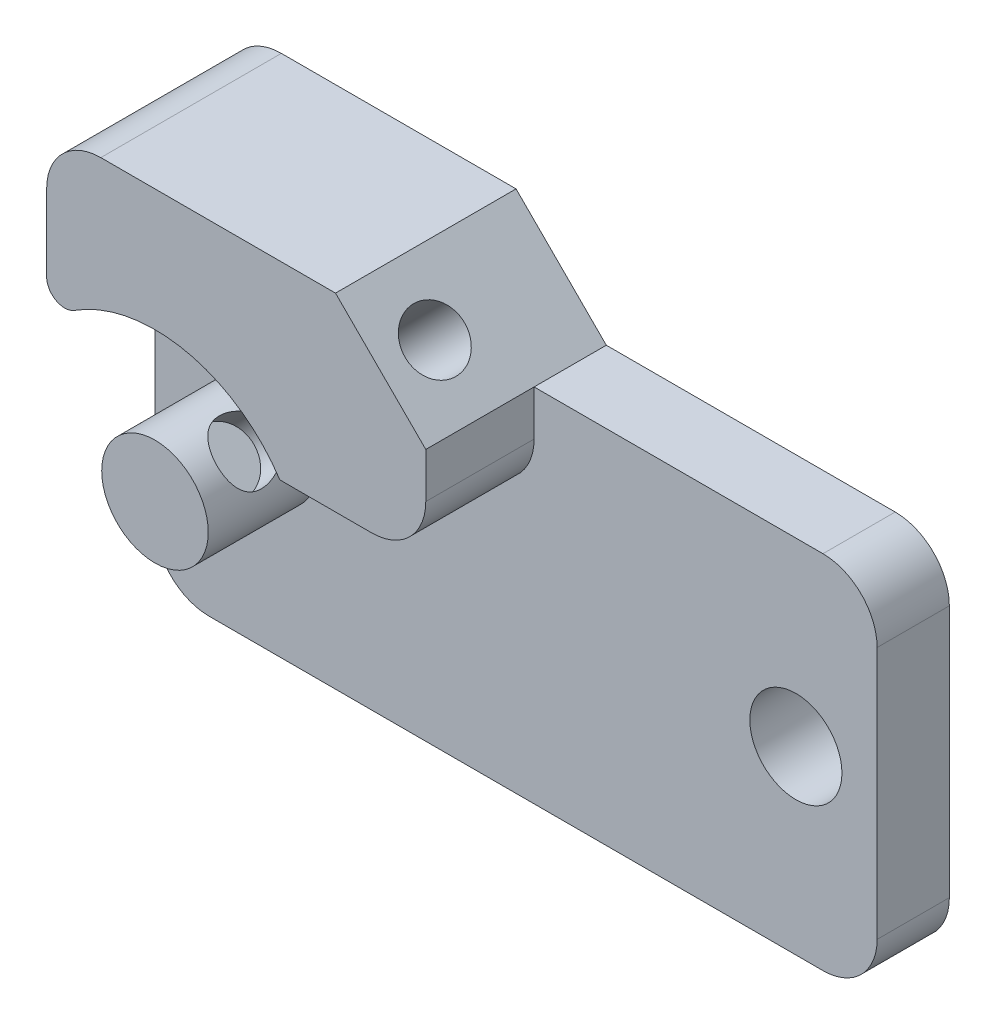
ISO-10303-21;
HEADER;
FILE_DESCRIPTION(('STEP AP214'),'2;1');
FILE_NAME('part.step','',(''),(''),'','','');
FILE_SCHEMA(('AUTOMOTIVE_DESIGN { 1 0 10303 214 1 1 1 1 }'));
ENDSEC;
DATA;
#1=APPLICATION_CONTEXT('core data for automotive mechanical design processes');
#2=APPLICATION_PROTOCOL_DEFINITION('international standard','automotive_design',2000,#1);
#3=PRODUCT_CONTEXT('',#1,'mechanical');
#4=PRODUCT('Part','Part','',(#3));
#5=PRODUCT_RELATED_PRODUCT_CATEGORY('part','',(#4));
#6=PRODUCT_DEFINITION_FORMATION('','',#4);
#7=PRODUCT_DEFINITION_CONTEXT('part definition',#1,'design');
#8=PRODUCT_DEFINITION('design','',#6,#7);
#9=PRODUCT_DEFINITION_SHAPE('','',#8);
#10=(LENGTH_UNIT() NAMED_UNIT(*) SI_UNIT(.MILLI.,.METRE.));
#11=(NAMED_UNIT(*) PLANE_ANGLE_UNIT() SI_UNIT($,.RADIAN.));
#12=(NAMED_UNIT(*) SI_UNIT($,.STERADIAN.) SOLID_ANGLE_UNIT());
#13=UNCERTAINTY_MEASURE_WITH_UNIT(LENGTH_MEASURE(1.E-05),#10,'distance_accuracy_value','');
#14=(GEOMETRIC_REPRESENTATION_CONTEXT(3) GLOBAL_UNCERTAINTY_ASSIGNED_CONTEXT((#13)) GLOBAL_UNIT_ASSIGNED_CONTEXT((#10,
#11,#12)) REPRESENTATION_CONTEXT('',''));
#15=CARTESIAN_POINT('',(0.,0.,0.));
#16=DIRECTION('',(0.,0.,1.));
#17=DIRECTION('',(1.,0.,0.));
#18=AXIS2_PLACEMENT_3D('',#15,#16,#17);
#19=CARTESIAN_POINT('',(0.,0.,4.));
#20=DIRECTION('',(0.,0.,-1.));
#21=DIRECTION('',(-1.,0.,0.));
#22=AXIS2_PLACEMENT_3D('',#19,#20,#21);
#23=PLANE('',#22);
#24=CARTESIAN_POINT('',(35.5,10.,4.));
#25=DIRECTION('',(0.,0.,-1.));
#26=DIRECTION('',(-1.,0.,0.));
#27=AXIS2_PLACEMENT_3D('',#24,#25,#26);
#28=CIRCLE('',#27,2.55);
#29=CARTESIAN_POINT('',(32.95,10.,4.));
#30=VERTEX_POINT('',#29);
#31=EDGE_CURVE('E186',#30,#30,#28,.T.);
#32=ORIENTED_EDGE('',*,*,#31,.T.);
#33=EDGE_LOOP('',(#32));
#34=FACE_BOUND('',#33,.T.);
#35=DIRECTION('',(0.,1.,0.));
#36=VECTOR('',#35,1.);
#37=CARTESIAN_POINT('',(40.,0.,4.));
#38=LINE('',#37,#36);
#39=CARTESIAN_POINT('',(40.,3.,4.));
#40=VERTEX_POINT('',#39);
#41=CARTESIAN_POINT('',(40.,17.,4.));
#42=VERTEX_POINT('',#41);
#43=EDGE_CURVE('E200',#40,#42,#38,.T.);
#44=ORIENTED_EDGE('',*,*,#43,.T.);
#45=CARTESIAN_POINT('',(37.,17.,4.));
#46=DIRECTION('',(0.,0.,-1.));
#47=DIRECTION('',(-1.,0.,0.));
#48=AXIS2_PLACEMENT_3D('',#45,#46,#47);
#49=CIRCLE('',#48,3.);
#50=CARTESIAN_POINT('',(37.,20.,4.));
#51=VERTEX_POINT('',#50);
#52=EDGE_CURVE('E262',#42,#51,#49,.F.);
#53=ORIENTED_EDGE('',*,*,#52,.T.);
#54=DIRECTION('',(-1.,0.,0.));
#55=VECTOR('',#54,1.);
#56=CARTESIAN_POINT('',(0.,20.,4.));
#57=LINE('',#56,#55);
#58=CARTESIAN_POINT('',(21.,20.,4.));
#59=VERTEX_POINT('',#58);
#60=EDGE_CURVE('E202',#51,#59,#57,.T.);
#61=ORIENTED_EDGE('',*,*,#60,.T.);
#62=DIRECTION('',(0.,1.,0.));
#63=VECTOR('',#62,1.);
#64=CARTESIAN_POINT('',(21.,25.,4.));
#65=LINE('',#64,#63);
#66=CARTESIAN_POINT('',(21.,17.5,4.));
#67=VERTEX_POINT('',#66);
#68=EDGE_CURVE('E168',#67,#59,#65,.T.);
#69=ORIENTED_EDGE('',*,*,#68,.F.);
#70=CARTESIAN_POINT('',(18.,17.5,4.));
#71=DIRECTION('',(0.,0.,-1.));
#72=DIRECTION('',(-1.,0.,0.));
#73=AXIS2_PLACEMENT_3D('',#70,#71,#72);
#74=CIRCLE('',#73,3.);
#75=CARTESIAN_POINT('',(18.,14.5,4.));
#76=VERTEX_POINT('',#75);
#77=EDGE_CURVE('E167',#67,#76,#74,.T.);
#78=ORIENTED_EDGE('',*,*,#77,.T.);
#79=DIRECTION('',(1.,0.,0.));
#80=VECTOR('',#79,1.);
#81=CARTESIAN_POINT('',(21.,14.5,4.));
#82=LINE('',#81,#80);
#83=CARTESIAN_POINT('',(12.9146583429697,14.5,4.));
#84=VERTEX_POINT('',#83);
#85=EDGE_CURVE('E159',#84,#76,#82,.T.);
#86=ORIENTED_EDGE('',*,*,#85,.F.);
#87=CARTESIAN_POINT('',(6.,10.,4.));
#88=DIRECTION('',(0.,0.,1.));
#89=DIRECTION('',(1.,0.,0.));
#90=AXIS2_PLACEMENT_3D('',#87,#88,#89);
#91=CIRCLE('',#90,8.25);
#92=CARTESIAN_POINT('',(1.54054054054054,16.9408732396895,4.));
#93=VERTEX_POINT('',#92);
#94=EDGE_CURVE('E146',#84,#93,#91,.T.);
#95=ORIENTED_EDGE('',*,*,#94,.T.);
#96=CARTESIAN_POINT('',(1.,17.7821912081367,4.));
#97=DIRECTION('',(0.,0.,-1.));
#98=DIRECTION('',(-1.,0.,0.));
#99=AXIS2_PLACEMENT_3D('',#96,#97,#98);
#100=CIRCLE('',#99,1.);
#101=CARTESIAN_POINT('',(0.,17.7821912081367,4.));
#102=VERTEX_POINT('',#101);
#103=EDGE_CURVE('E11',#93,#102,#100,.T.);
#104=ORIENTED_EDGE('',*,*,#103,.T.);
#105=DIRECTION('',(0.,-1.,0.));
#106=VECTOR('',#105,1.);
#107=CARTESIAN_POINT('',(0.,0.,4.));
#108=LINE('',#107,#106);
#109=CARTESIAN_POINT('',(0.,3.,4.));
#110=VERTEX_POINT('',#109);
#111=EDGE_CURVE('E193',#102,#110,#108,.T.);
#112=ORIENTED_EDGE('',*,*,#111,.T.);
#113=CARTESIAN_POINT('',(3.,3.,4.));
#114=DIRECTION('',(0.,0.,-1.));
#115=DIRECTION('',(-1.,0.,0.));
#116=AXIS2_PLACEMENT_3D('',#113,#114,#115);
#117=CIRCLE('',#116,3.);
#118=CARTESIAN_POINT('',(3.,0.,4.));
#119=VERTEX_POINT('',#118);
#120=EDGE_CURVE('E258',#110,#119,#117,.F.);
#121=ORIENTED_EDGE('',*,*,#120,.T.);
#122=DIRECTION('',(1.,0.,0.));
#123=VECTOR('',#122,1.);
#124=CARTESIAN_POINT('',(0.,0.,4.));
#125=LINE('',#124,#123);
#126=CARTESIAN_POINT('',(37.,0.,4.));
#127=VERTEX_POINT('',#126);
#128=EDGE_CURVE('E196',#119,#127,#125,.T.);
#129=ORIENTED_EDGE('',*,*,#128,.T.);
#130=CARTESIAN_POINT('',(37.,3.,4.));
#131=DIRECTION('',(0.,0.,-1.));
#132=DIRECTION('',(-1.,0.,0.));
#133=AXIS2_PLACEMENT_3D('',#130,#131,#132);
#134=CIRCLE('',#133,3.);
#135=EDGE_CURVE('E260',#127,#40,#134,.F.);
#136=ORIENTED_EDGE('',*,*,#135,.T.);
#137=EDGE_LOOP('',(#44,#53,#61,#69,#78,#86,#95,#104,#112,#121,#129,#136));
#138=FACE_BOUND('',#137,.T.);
#139=CARTESIAN_POINT('',(6.,10.,4.));
#140=DIRECTION('',(0.,0.,-1.));
#141=DIRECTION('',(-1.,0.,0.));
#142=AXIS2_PLACEMENT_3D('',#139,#140,#141);
#143=CIRCLE('',#142,2.95);
#144=CARTESIAN_POINT('',(3.05,10.,4.));
#145=VERTEX_POINT('',#144);
#146=EDGE_CURVE('E204',#145,#145,#143,.F.);
#147=ORIENTED_EDGE('',*,*,#146,.F.);
#148=EDGE_LOOP('',(#147));
#149=FACE_BOUND('',#148,.T.);
#150=ADVANCED_FACE('F39',(#34,#138,#149),#23,.F.);
#151=CARTESIAN_POINT('',(0.,0.,4.));
#152=DIRECTION('',(1.,0.,0.));
#153=DIRECTION('',(0.,0.,-1.));
#154=AXIS2_PLACEMENT_3D('',#151,#152,#153);
#155=PLANE('',#154);
#156=ORIENTED_EDGE('',*,*,#111,.F.);
#157=DIRECTION('',(0.,0.,1.));
#158=VECTOR('',#157,1.);
#159=CARTESIAN_POINT('',(0.,17.7821912081367,4.));
#160=LINE('',#159,#158);
#161=CARTESIAN_POINT('',(0.,17.7821912081367,10.));
#162=VERTEX_POINT('',#161);
#163=EDGE_CURVE('E270',#102,#162,#160,.T.);
#164=ORIENTED_EDGE('',*,*,#163,.T.);
#165=DIRECTION('',(0.,-1.,0.));
#166=VECTOR('',#165,1.);
#167=CARTESIAN_POINT('',(0.,14.5,10.));
#168=LINE('',#167,#166);
#169=CARTESIAN_POINT('',(0.,22.,10.));
#170=VERTEX_POINT('',#169);
#171=EDGE_CURVE('E171',#170,#162,#168,.T.);
#172=ORIENTED_EDGE('',*,*,#171,.F.);
#173=DIRECTION('',(0.,0.,1.));
#174=VECTOR('',#173,1.);
#175=CARTESIAN_POINT('',(0.,22.,0.));
#176=LINE('',#175,#174);
#177=CARTESIAN_POINT('',(0.,22.,0.));
#178=VERTEX_POINT('',#177);
#179=EDGE_CURVE('E235',#170,#178,#176,.F.);
#180=ORIENTED_EDGE('',*,*,#179,.T.);
#181=DIRECTION('',(0.,-1.,0.));
#182=VECTOR('',#181,1.);
#183=CARTESIAN_POINT('',(0.,0.,0.));
#184=LINE('',#183,#182);
#185=CARTESIAN_POINT('',(0.,3.,0.));
#186=VERTEX_POINT('',#185);
#187=EDGE_CURVE('E192',#178,#186,#184,.T.);
#188=ORIENTED_EDGE('',*,*,#187,.T.);
#189=DIRECTION('',(0.,0.,-1.));
#190=VECTOR('',#189,1.);
#191=CARTESIAN_POINT('',(0.,3.,4.));
#192=LINE('',#191,#190);
#193=EDGE_CURVE('E233',#186,#110,#192,.F.);
#194=ORIENTED_EDGE('',*,*,#193,.T.);
#195=EDGE_LOOP('',(#156,#164,#172,#180,#188,#194));
#196=FACE_BOUND('',#195,.T.);
#197=ADVANCED_FACE('F276',(#196),#155,.F.);
#198=CARTESIAN_POINT('',(0.,0.,4.));
#199=DIRECTION('',(0.,1.,0.));
#200=DIRECTION('',(0.,0.,1.));
#201=AXIS2_PLACEMENT_3D('',#198,#199,#200);
#202=PLANE('',#201);
#203=DIRECTION('',(1.,0.,0.));
#204=VECTOR('',#203,1.);
#205=CARTESIAN_POINT('',(0.,0.,0.));
#206=LINE('',#205,#204);
#207=CARTESIAN_POINT('',(3.,0.,0.));
#208=VERTEX_POINT('',#207);
#209=CARTESIAN_POINT('',(37.,0.,0.));
#210=VERTEX_POINT('',#209);
#211=EDGE_CURVE('E207',#208,#210,#206,.T.);
#212=ORIENTED_EDGE('',*,*,#211,.T.);
#213=DIRECTION('',(0.,0.,-1.));
#214=VECTOR('',#213,1.);
#215=CARTESIAN_POINT('',(37.,0.,4.));
#216=LINE('',#215,#214);
#217=EDGE_CURVE('E267',#210,#127,#216,.F.);
#218=ORIENTED_EDGE('',*,*,#217,.T.);
#219=ORIENTED_EDGE('',*,*,#128,.F.);
#220=DIRECTION('',(0.,0.,-1.));
#221=VECTOR('',#220,1.);
#222=CARTESIAN_POINT('',(3.,0.,4.));
#223=LINE('',#222,#221);
#224=EDGE_CURVE('E264',#119,#208,#223,.T.);
#225=ORIENTED_EDGE('',*,*,#224,.T.);
#226=EDGE_LOOP('',(#212,#218,#219,#225));
#227=FACE_BOUND('',#226,.T.);
#228=ADVANCED_FACE('F313',(#227),#202,.F.);
#229=CARTESIAN_POINT('',(40.,0.,4.));
#230=DIRECTION('',(-1.,0.,0.));
#231=DIRECTION('',(0.,0.,1.));
#232=AXIS2_PLACEMENT_3D('',#229,#230,#231);
#233=PLANE('',#232);
#234=DIRECTION('',(0.,1.,0.));
#235=VECTOR('',#234,1.);
#236=CARTESIAN_POINT('',(40.,0.,0.));
#237=LINE('',#236,#235);
#238=CARTESIAN_POINT('',(40.,3.,0.));
#239=VERTEX_POINT('',#238);
#240=CARTESIAN_POINT('',(40.,17.,0.));
#241=VERTEX_POINT('',#240);
#242=EDGE_CURVE('E210',#239,#241,#237,.T.);
#243=ORIENTED_EDGE('',*,*,#242,.T.);
#244=DIRECTION('',(0.,0.,-1.));
#245=VECTOR('',#244,1.);
#246=CARTESIAN_POINT('',(40.,17.,4.));
#247=LINE('',#246,#245);
#248=EDGE_CURVE('E256',#241,#42,#247,.F.);
#249=ORIENTED_EDGE('',*,*,#248,.T.);
#250=ORIENTED_EDGE('',*,*,#43,.F.);
#251=DIRECTION('',(0.,0.,-1.));
#252=VECTOR('',#251,1.);
#253=CARTESIAN_POINT('',(40.,3.,4.));
#254=LINE('',#253,#252);
#255=EDGE_CURVE('E253',#40,#239,#254,.T.);
#256=ORIENTED_EDGE('',*,*,#255,.T.);
#257=EDGE_LOOP('',(#243,#249,#250,#256));
#258=FACE_BOUND('',#257,.T.);
#259=ADVANCED_FACE('F322',(#258),#233,.F.);
#260=CARTESIAN_POINT('',(0.,20.,4.));
#261=DIRECTION('',(0.,-1.,0.));
#262=DIRECTION('',(0.,0.,-1.));
#263=AXIS2_PLACEMENT_3D('',#260,#261,#262);
#264=PLANE('',#263);
#265=ORIENTED_EDGE('',*,*,#60,.F.);
#266=DIRECTION('',(0.,0.,-1.));
#267=VECTOR('',#266,1.);
#268=CARTESIAN_POINT('',(37.,20.,4.));
#269=LINE('',#268,#267);
#270=CARTESIAN_POINT('',(37.,20.,0.));
#271=VERTEX_POINT('',#270);
#272=EDGE_CURVE('E250',#51,#271,#269,.T.);
#273=ORIENTED_EDGE('',*,*,#272,.T.);
#274=DIRECTION('',(-1.,0.,0.));
#275=VECTOR('',#274,1.);
#276=CARTESIAN_POINT('',(0.,20.,0.));
#277=LINE('',#276,#275);
#278=CARTESIAN_POINT('',(21.,20.,0.));
#279=VERTEX_POINT('',#278);
#280=EDGE_CURVE('E197',#271,#279,#277,.T.);
#281=ORIENTED_EDGE('',*,*,#280,.T.);
#282=DIRECTION('',(0.,0.,1.));
#283=VECTOR('',#282,1.);
#284=CARTESIAN_POINT('',(21.,20.,0.));
#285=LINE('',#284,#283);
#286=EDGE_CURVE('E180',#279,#59,#285,.T.);
#287=ORIENTED_EDGE('',*,*,#286,.T.);
#288=EDGE_LOOP('',(#265,#273,#281,#287));
#289=FACE_BOUND('',#288,.T.);
#290=ADVANCED_FACE('F330',(#289),#264,.F.);
#291=CARTESIAN_POINT('',(0.,0.,0.));
#292=DIRECTION('',(0.,0.,-1.));
#293=DIRECTION('',(-1.,0.,0.));
#294=AXIS2_PLACEMENT_3D('',#291,#292,#293);
#295=PLANE('',#294);
#296=CARTESIAN_POINT('',(35.5,10.,0.));
#297=DIRECTION('',(0.,0.,1.));
#298=DIRECTION('',(1.,0.,0.));
#299=AXIS2_PLACEMENT_3D('',#296,#297,#298);
#300=CIRCLE('',#299,2.55);
#301=CARTESIAN_POINT('',(38.05,10.,0.));
#302=VERTEX_POINT('',#301);
#303=EDGE_CURVE('E183',#302,#302,#300,.T.);
#304=ORIENTED_EDGE('',*,*,#303,.T.);
#305=EDGE_LOOP('',(#304));
#306=FACE_BOUND('',#305,.T.);
#307=ORIENTED_EDGE('',*,*,#187,.F.);
#308=CARTESIAN_POINT('',(3.,22.,0.));
#309=DIRECTION('',(0.,0.,-1.));
#310=DIRECTION('',(-1.,0.,0.));
#311=AXIS2_PLACEMENT_3D('',#308,#309,#310);
#312=CIRCLE('',#311,3.);
#313=CARTESIAN_POINT('',(3.00000000000001,25.,0.));
#314=VERTEX_POINT('',#313);
#315=EDGE_CURVE('E243',#178,#314,#312,.T.);
#316=ORIENTED_EDGE('',*,*,#315,.T.);
#317=DIRECTION('',(-1.,0.,0.));
#318=VECTOR('',#317,1.);
#319=CARTESIAN_POINT('',(21.,25.,0.));
#320=LINE('',#319,#318);
#321=CARTESIAN_POINT('',(16.,25.,0.));
#322=VERTEX_POINT('',#321);
#323=EDGE_CURVE('E177',#322,#314,#320,.T.);
#324=ORIENTED_EDGE('',*,*,#323,.F.);
#325=DIRECTION('',(-0.707106781186548,0.707106781186547,0.));
#326=VECTOR('',#325,1.);
#327=CARTESIAN_POINT('',(20.5,20.5,0.));
#328=LINE('',#327,#326);
#329=EDGE_CURVE('E223',#322,#279,#328,.F.);
#330=ORIENTED_EDGE('',*,*,#329,.T.);
#331=ORIENTED_EDGE('',*,*,#280,.F.);
#332=CARTESIAN_POINT('',(37.,17.,0.));
#333=DIRECTION('',(0.,0.,-1.));
#334=DIRECTION('',(-1.,0.,0.));
#335=AXIS2_PLACEMENT_3D('',#332,#333,#334);
#336=CIRCLE('',#335,3.);
#337=EDGE_CURVE('E241',#271,#241,#336,.T.);
#338=ORIENTED_EDGE('',*,*,#337,.T.);
#339=ORIENTED_EDGE('',*,*,#242,.F.);
#340=CARTESIAN_POINT('',(37.,3.,0.));
#341=DIRECTION('',(0.,0.,-1.));
#342=DIRECTION('',(-1.,0.,0.));
#343=AXIS2_PLACEMENT_3D('',#340,#341,#342);
#344=CIRCLE('',#343,3.);
#345=EDGE_CURVE('E239',#239,#210,#344,.T.);
#346=ORIENTED_EDGE('',*,*,#345,.T.);
#347=ORIENTED_EDGE('',*,*,#211,.F.);
#348=CARTESIAN_POINT('',(3.,3.,0.));
#349=DIRECTION('',(0.,0.,-1.));
#350=DIRECTION('',(-1.,0.,0.));
#351=AXIS2_PLACEMENT_3D('',#348,#349,#350);
#352=CIRCLE('',#351,3.);
#353=EDGE_CURVE('E237',#208,#186,#352,.T.);
#354=ORIENTED_EDGE('',*,*,#353,.T.);
#355=EDGE_LOOP('',(#307,#316,#324,#330,#331,#338,#339,#346,#347,#354));
#356=FACE_BOUND('',#355,.T.);
#357=ADVANCED_FACE('F301',(#306,#356),#295,.T.);
#358=CARTESIAN_POINT('',(6.,10.,10.));
#359=DIRECTION('',(0.,0.,-1.));
#360=DIRECTION('',(-1.,0.,0.));
#361=AXIS2_PLACEMENT_3D('',#358,#359,#360);
#362=CYLINDRICAL_SURFACE('',#361,2.95);
#363=CARTESIAN_POINT('',(6.56243545762126,12.8958878355369,7.));
#364=CARTESIAN_POINT('',(6.56244621334683,12.8958897100662,6.91571959930421));
#365=CARTESIAN_POINT('',(6.57016352925686,12.8944198089467,6.831372396815));
#366=CARTESIAN_POINT('',(6.60025562682326,12.8883233933822,6.66540446327572));
#367=CARTESIAN_POINT('',(6.62265410438806,12.8836917753132,6.5837883645391));
#368=CARTESIAN_POINT('',(6.6799059684542,12.8707271711623,6.42602150117651));
#369=CARTESIAN_POINT('',(6.71467921096874,12.862417920435,6.34983926976143));
#370=CARTESIAN_POINT('',(6.79437193949597,12.8413321287358,6.20369933137473));
#371=CARTESIAN_POINT('',(6.83929376748614,12.8285545562409,6.13374306636478));
#372=CARTESIAN_POINT('',(6.94223160850177,12.7960516747961,5.99397601421134));
#373=CARTESIAN_POINT('',(7.00112656355548,12.7757385219983,5.92494900560147));
#374=CARTESIAN_POINT('',(7.12603247102776,12.7274600435008,5.79663519647524));
#375=CARTESIAN_POINT('',(7.1920478057124,12.6994899888569,5.73735445163791));
#376=CARTESIAN_POINT('',(7.33487773986193,12.6319911958965,5.62497678562589));
#377=CARTESIAN_POINT('',(7.41212987995474,12.5916507678616,5.57291133975971));
#378=CARTESIAN_POINT('',(7.56877179984377,12.4999329949919,5.4838743279054));
#379=CARTESIAN_POINT('',(7.64815984227044,12.4485643965668,5.4468908674486));
#380=CARTESIAN_POINT('',(7.7986608411229,12.3399108860554,5.39240440616696));
#381=CARTESIAN_POINT('',(7.86990124202785,12.2835065838453,5.37350685782954));
#382=CARTESIAN_POINT('',(8.00810225773013,12.1629626776116,5.35106593858385));
#383=CARTESIAN_POINT('',(8.07506621278805,12.0988292266083,5.34751043609714));
#384=CARTESIAN_POINT('',(8.19525654132589,11.9723423783871,5.35548092869562));
#385=CARTESIAN_POINT('',(8.24918536504682,11.9105470924384,5.3654168640907));
#386=CARTESIAN_POINT('',(8.3503683439715,11.7845991398933,5.39714223942466));
#387=CARTESIAN_POINT('',(8.39762198297131,11.7204462914653,5.41893259545561));
#388=CARTESIAN_POINT('',(8.48528003729855,11.5912403803174,5.47371452260012));
#389=CARTESIAN_POINT('',(8.52561132399053,11.5261847263776,5.50681580393971));
#390=CARTESIAN_POINT('',(8.59886027110585,11.397817817427,5.58303506217861));
#391=CARTESIAN_POINT('',(8.63177562646494,11.3345071101429,5.62615614505593));
#392=CARTESIAN_POINT('',(8.69387039670044,11.2046956107103,5.72659154963281));
#393=CARTESIAN_POINT('',(8.72223871079391,11.1386118004629,5.7849461632694));
#394=CARTESIAN_POINT('',(8.77134436459376,11.0132583211279,5.91147460246535));
#395=CARTESIAN_POINT('',(8.79207340365295,10.9539961120036,5.97965899760449));
#396=CARTESIAN_POINT('',(8.82861629080377,10.839847561285,6.13150752825893));
#397=CARTESIAN_POINT('',(8.84379601243528,10.7858767472896,6.21602082319448));
#398=CARTESIAN_POINT('',(8.86781916047632,10.693126996512,6.39383519059808));
#399=CARTESIAN_POINT('',(8.87666993660692,10.6543304618469,6.4871259269434));
#400=CARTESIAN_POINT('',(8.88883885238788,10.5982315624336,6.67220698232945));
#401=CARTESIAN_POINT('',(8.89254361996539,10.5794555038106,6.7635181118308));
#402=CARTESIAN_POINT('',(8.89631132579573,10.560350783551,6.94808398774242));
#403=CARTESIAN_POINT('',(8.89637883879146,10.5599989489334,7.04133614506475));
#404=CARTESIAN_POINT('',(8.89315834791193,10.5763414859411,7.21178819692711));
#405=CARTESIAN_POINT('',(8.89038143451999,10.590439697345,7.28926385052465));
#406=CARTESIAN_POINT('',(8.88188722914663,10.6305903901313,7.44088251364095));
#407=CARTESIAN_POINT('',(8.87616855546117,10.6566484882863,7.51502393930906));
#408=CARTESIAN_POINT('',(8.86093538820456,10.720173716499,7.66140361574009));
#409=CARTESIAN_POINT('',(8.85127628913896,10.7580608815347,7.73344257216199));
#410=CARTESIAN_POINT('',(8.82742136859736,10.8426867289915,7.87128846841963));
#411=CARTESIAN_POINT('',(8.81322335415037,10.8894296856206,7.93709237583536));
#412=CARTESIAN_POINT('',(8.77669898628128,10.9981196964389,8.07198292669743));
#413=CARTESIAN_POINT('',(8.75341818781033,11.0613028617827,8.13982072664163));
#414=CARTESIAN_POINT('',(8.69838969901738,11.1943103100112,8.26479352016757));
#415=CARTESIAN_POINT('',(8.66663662341053,11.2641387986775,8.32192166684547));
#416=CARTESIAN_POINT('',(8.59163586720684,11.4117890151715,8.42685507922373));
#417=CARTESIAN_POINT('',(8.54784358195159,11.4898393925175,8.47395814990238));
#418=CARTESIAN_POINT('',(8.44926301265616,11.6468668019253,8.55250104031157));
#419=CARTESIAN_POINT('',(8.39448653502901,11.7258427540379,8.58395755254));
#420=CARTESIAN_POINT('',(8.28083919252712,11.8729667967743,8.62706440089967));
#421=CARTESIAN_POINT('',(8.22297563387383,11.9413907179669,8.64042490981906));
#422=CARTESIAN_POINT('',(8.10049406706849,12.0732835857409,8.65234333529475));
#423=CARTESIAN_POINT('',(8.0358799171638,12.1367553268552,8.65090966203012));
#424=CARTESIAN_POINT('',(7.90854380656111,12.2509079320246,8.63418372545536));
#425=CARTESIAN_POINT('',(7.84621608181371,12.3022303993235,8.62020844977611));
#426=CARTESIAN_POINT('',(7.71994318395124,12.3980364113934,8.58086949972453));
#427=CARTESIAN_POINT('',(7.65599782480711,12.442519165391,8.55550450985734));
#428=CARTESIAN_POINT('',(7.52647330751069,12.5255673544725,8.49339621899817));
#429=CARTESIAN_POINT('',(7.46090712234652,12.5638986903406,8.45631568279936));
#430=CARTESIAN_POINT('',(7.33222957009398,12.6330607500861,8.37225605992447));
#431=CARTESIAN_POINT('',(7.26911916366424,12.6638885630086,8.32527314481601));
#432=CARTESIAN_POINT('',(7.1400783348262,12.7218173490823,8.21643674987325));
#433=CARTESIAN_POINT('',(7.07468599460809,12.7480565236505,8.15348523890002));
#434=CARTESIAN_POINT('',(6.95186065751703,12.7929820693344,8.01772944807719));
#435=CARTESIAN_POINT('',(6.89443787605599,12.8116588045919,7.94491275486734));
#436=CARTESIAN_POINT('',(6.78663904994568,12.8437807046747,7.78490400729256));
#437=CARTESIAN_POINT('',(6.73709332072259,12.8567393362374,7.6970482256328));
#438=CARTESIAN_POINT('',(6.65472662494905,12.8767445115365,7.51331439119353));
#439=CARTESIAN_POINT('',(6.62185351489172,12.8838095327593,7.41746245530124));
#440=CARTESIAN_POINT('',(6.58707265612809,12.8910182143928,7.26696477625861));
#441=CARTESIAN_POINT('',(6.5778731624717,12.8928535951827,7.21401788764086));
#442=CARTESIAN_POINT('',(6.56555137072367,12.8952877607393,7.10738967069868));
#443=CARTESIAN_POINT('',(6.56242860344402,12.8958866409772,7.05370839939873));
#444=CARTESIAN_POINT('',(6.56243545762126,12.8958878355369,7.));
#445=B_SPLINE_CURVE_WITH_KNOTS('',3,(#363,#364,#365,#366,#367,#368,#369,#370,#371,#372,#373,
#374,#375,#376,#377,#378,#379,#380,#381,#382,#383,#384,#385,#386,#387,#388,#389,#390,#391,#392,
#393,#394,#395,#396,#397,#398,#399,#400,#401,#402,#403,#404,#405,#406,#407,#408,#409,#410,#411,
#412,#413,#414,#415,#416,#417,#418,#419,#420,#421,#422,#423,#424,#425,#426,#427,#428,#429,#430,
#431,#432,#433,#434,#435,#436,#437,#438,#439,#440,#441,#442,#443,#444),.UNSPECIFIED.,.T.,.F.,(4,
2,2,2,2,2,2,2,2,2,2,2,2,2,2,2,2,2,2,2,2,2,2,2,2,2,2,2,2,2,2,2,2,2,2,2,2,2,2,2,4),(0.,
0.252612570788526,0.505633874451649,0.757045470944626,1.00851514477673,1.28634223647994,
1.56434130433377,1.86727371680999,2.16996675622503,2.44679503279469,2.72340436984843,
2.97008715148733,3.21678899911492,3.46595504913513,3.71519843992236,3.99190107565829,
4.26890348930606,4.57159533592277,4.87393509709336,5.15203904131956,5.4297931932075,
5.66511119243718,5.9005398183228,6.14552130908417,6.3906213416697,6.67614936134049,
6.96185930707662,7.26358644918277,7.56499100018378,7.8352635463449,8.10538245675904,
8.35007936534792,8.59480454333405,8.84733842911774,9.09997012859093,9.38224639335149,
9.66488120366786,9.96832921625662,10.2708222528003,10.43181418455,10.592793685514),.UNSPECIFIED.);
#446=CARTESIAN_POINT('',(6.56243545762126,12.8958878355369,7.));
#447=VERTEX_POINT('',#446);
#448=EDGE_CURVE('E337',#447,#447,#445,.T.);
#449=ORIENTED_EDGE('',*,*,#448,.T.);
#450=EDGE_LOOP('',(#449));
#451=FACE_BOUND('',#450,.T.);
#452=CARTESIAN_POINT('',(6.,10.,10.));
#453=DIRECTION('',(0.,0.,1.));
#454=DIRECTION('',(1.,0.,0.));
#455=AXIS2_PLACEMENT_3D('',#452,#453,#454);
#456=CIRCLE('',#455,2.95);
#457=CARTESIAN_POINT('',(8.95,10.,10.));
#458=VERTEX_POINT('',#457);
#459=EDGE_CURVE('E189',#458,#458,#456,.T.);
#460=ORIENTED_EDGE('',*,*,#459,.F.);
#461=EDGE_LOOP('',(#460));
#462=FACE_BOUND('',#461,.T.);
#463=ORIENTED_EDGE('',*,*,#146,.T.);
#464=EDGE_LOOP('',(#463));
#465=FACE_BOUND('',#464,.T.);
#466=ADVANCED_FACE('F352',(#451,#462,#465),#362,.T.);
#467=CARTESIAN_POINT('',(6.,10.,10.));
#468=DIRECTION('',(0.,0.,1.));
#469=DIRECTION('',(1.,0.,0.));
#470=AXIS2_PLACEMENT_3D('',#467,#468,#469);
#471=PLANE('',#470);
#472=ORIENTED_EDGE('',*,*,#459,.T.);
#473=EDGE_LOOP('',(#472));
#474=FACE_BOUND('',#473,.T.);
#475=ADVANCED_FACE('F378',(#474),#471,.T.);
#476=CARTESIAN_POINT('',(35.5,10.,0.));
#477=DIRECTION('',(0.,0.,1.));
#478=DIRECTION('',(1.,0.,0.));
#479=AXIS2_PLACEMENT_3D('',#476,#477,#478);
#480=CYLINDRICAL_SURFACE('',#479,2.55);
#481=ORIENTED_EDGE('',*,*,#303,.F.);
#482=EDGE_LOOP('',(#481));
#483=FACE_BOUND('',#482,.T.);
#484=ORIENTED_EDGE('',*,*,#31,.F.);
#485=EDGE_LOOP('',(#484));
#486=FACE_BOUND('',#485,.T.);
#487=ADVANCED_FACE('F374',(#483,#486),#480,.F.);
#488=CARTESIAN_POINT('',(21.,25.,0.));
#489=DIRECTION('',(0.,1.,0.));
#490=DIRECTION('',(-1.,0.,0.));
#491=AXIS2_PLACEMENT_3D('',#488,#489,#490);
#492=PLANE('',#491);
#493=ORIENTED_EDGE('',*,*,#323,.T.);
#494=DIRECTION('',(0.,0.,1.));
#495=VECTOR('',#494,1.);
#496=CARTESIAN_POINT('',(3.,25.,10.));
#497=LINE('',#496,#495);
#498=CARTESIAN_POINT('',(3.,25.,10.));
#499=VERTEX_POINT('',#498);
#500=EDGE_CURVE('E226',#314,#499,#497,.T.);
#501=ORIENTED_EDGE('',*,*,#500,.T.);
#502=DIRECTION('',(-1.,0.,0.));
#503=VECTOR('',#502,1.);
#504=CARTESIAN_POINT('',(0.,25.,10.));
#505=LINE('',#504,#503);
#506=CARTESIAN_POINT('',(16.,25.,10.));
#507=VERTEX_POINT('',#506);
#508=EDGE_CURVE('E174',#507,#499,#505,.T.);
#509=ORIENTED_EDGE('',*,*,#508,.F.);
#510=DIRECTION('',(0.,0.,-1.));
#511=VECTOR('',#510,1.);
#512=CARTESIAN_POINT('',(16.,25.,0.));
#513=LINE('',#512,#511);
#514=EDGE_CURVE('E221',#507,#322,#513,.T.);
#515=ORIENTED_EDGE('',*,*,#514,.T.);
#516=EDGE_LOOP('',(#493,#501,#509,#515));
#517=FACE_BOUND('',#516,.T.);
#518=ADVANCED_FACE('F290',(#517),#492,.T.);
#519=CARTESIAN_POINT('',(21.,20.,0.));
#520=DIRECTION('',(1.,0.,0.));
#521=DIRECTION('',(0.,0.,-1.));
#522=AXIS2_PLACEMENT_3D('',#519,#520,#521);
#523=PLANE('',#522);
#524=DIRECTION('',(0.,1.,0.));
#525=VECTOR('',#524,1.);
#526=CARTESIAN_POINT('',(21.,25.,10.));
#527=LINE('',#526,#525);
#528=CARTESIAN_POINT('',(21.,17.5,10.));
#529=VERTEX_POINT('',#528);
#530=CARTESIAN_POINT('',(21.,20.,10.));
#531=VERTEX_POINT('',#530);
#532=EDGE_CURVE('E282',#529,#531,#527,.T.);
#533=ORIENTED_EDGE('',*,*,#532,.F.);
#534=DIRECTION('',(0.,0.,-1.));
#535=VECTOR('',#534,1.);
#536=CARTESIAN_POINT('',(21.,17.5,4.));
#537=LINE('',#536,#535);
#538=EDGE_CURVE('E245',#529,#67,#537,.T.);
#539=ORIENTED_EDGE('',*,*,#538,.T.);
#540=ORIENTED_EDGE('',*,*,#68,.T.);
#541=DIRECTION('',(0.,0.,1.));
#542=VECTOR('',#541,1.);
#543=CARTESIAN_POINT('',(21.,20.,0.));
#544=LINE('',#543,#542);
#545=EDGE_CURVE('E216',#59,#531,#544,.T.);
#546=ORIENTED_EDGE('',*,*,#545,.T.);
#547=EDGE_LOOP('',(#533,#539,#540,#546));
#548=FACE_BOUND('',#547,.T.);
#549=ADVANCED_FACE('F332',(#548),#523,.T.);
#550=CARTESIAN_POINT('',(21.,14.5,10.));
#551=DIRECTION('',(0.,1.,0.));
#552=DIRECTION('',(-1.,0.,0.));
#553=AXIS2_PLACEMENT_3D('',#550,#551,#552);
#554=PLANE('',#553);
#555=ORIENTED_EDGE('',*,*,#85,.T.);
#556=DIRECTION('',(0.,0.,-1.));
#557=VECTOR('',#556,1.);
#558=CARTESIAN_POINT('',(18.,14.5,10.));
#559=LINE('',#558,#557);
#560=CARTESIAN_POINT('',(18.,14.5,10.));
#561=VERTEX_POINT('',#560);
#562=EDGE_CURVE('E248',#76,#561,#559,.F.);
#563=ORIENTED_EDGE('',*,*,#562,.T.);
#564=DIRECTION('',(1.,0.,0.));
#565=VECTOR('',#564,1.);
#566=CARTESIAN_POINT('',(21.,14.5,10.));
#567=LINE('',#566,#565);
#568=CARTESIAN_POINT('',(12.9146583429697,14.5,10.));
#569=VERTEX_POINT('',#568);
#570=EDGE_CURVE('E162',#569,#561,#567,.T.);
#571=ORIENTED_EDGE('',*,*,#570,.F.);
#572=DIRECTION('',(0.,0.,1.));
#573=VECTOR('',#572,1.);
#574=CARTESIAN_POINT('',(12.9146583429697,14.5,4.));
#575=LINE('',#574,#573);
#576=EDGE_CURVE('E149',#569,#84,#575,.F.);
#577=ORIENTED_EDGE('',*,*,#576,.T.);
#578=EDGE_LOOP('',(#555,#563,#571,#577));
#579=FACE_BOUND('',#578,.T.);
#580=ADVANCED_FACE('F158',(#579),#554,.F.);
#581=CARTESIAN_POINT('',(0.,0.,10.));
#582=DIRECTION('',(0.,0.,-1.));
#583=DIRECTION('',(-1.,0.,0.));
#584=AXIS2_PLACEMENT_3D('',#581,#582,#583);
#585=PLANE('',#584);
#586=ORIENTED_EDGE('',*,*,#171,.T.);
#587=CARTESIAN_POINT('',(1.,17.7821912081367,10.));
#588=DIRECTION('',(0.,0.,-1.));
#589=DIRECTION('',(-1.,0.,0.));
#590=AXIS2_PLACEMENT_3D('',#587,#588,#589);
#591=CIRCLE('',#590,1.);
#592=CARTESIAN_POINT('',(1.54054054054054,16.9408732396895,10.));
#593=VERTEX_POINT('',#592);
#594=EDGE_CURVE('E61',#162,#593,#591,.F.);
#595=ORIENTED_EDGE('',*,*,#594,.T.);
#596=CARTESIAN_POINT('',(6.,10.,10.));
#597=DIRECTION('',(0.,0.,1.));
#598=DIRECTION('',(1.,0.,0.));
#599=AXIS2_PLACEMENT_3D('',#596,#597,#598);
#600=CIRCLE('',#599,8.25);
#601=EDGE_CURVE('E153',#569,#593,#600,.T.);
#602=ORIENTED_EDGE('',*,*,#601,.F.);
#603=ORIENTED_EDGE('',*,*,#570,.T.);
#604=CARTESIAN_POINT('',(18.,17.5,10.));
#605=DIRECTION('',(0.,0.,-1.));
#606=DIRECTION('',(-1.,0.,0.));
#607=AXIS2_PLACEMENT_3D('',#604,#605,#606);
#608=CIRCLE('',#607,3.);
#609=EDGE_CURVE('E229',#561,#529,#608,.F.);
#610=ORIENTED_EDGE('',*,*,#609,.T.);
#611=ORIENTED_EDGE('',*,*,#532,.T.);
#612=DIRECTION('',(0.707106781186548,-0.707106781186547,0.));
#613=VECTOR('',#612,1.);
#614=CARTESIAN_POINT('',(21.,20.,10.));
#615=LINE('',#614,#613);
#616=EDGE_CURVE('E219',#531,#507,#615,.F.);
#617=ORIENTED_EDGE('',*,*,#616,.T.);
#618=ORIENTED_EDGE('',*,*,#508,.T.);
#619=CARTESIAN_POINT('',(3.,22.,10.));
#620=DIRECTION('',(0.,0.,-1.));
#621=DIRECTION('',(-1.,0.,0.));
#622=AXIS2_PLACEMENT_3D('',#619,#620,#621);
#623=CIRCLE('',#622,3.);
#624=EDGE_CURVE('E231',#499,#170,#623,.F.);
#625=ORIENTED_EDGE('',*,*,#624,.T.);
#626=EDGE_LOOP('',(#586,#595,#602,#603,#610,#611,#617,#618,#625));
#627=FACE_BOUND('',#626,.T.);
#628=ADVANCED_FACE('F279',(#627),#585,.F.);
#629=CARTESIAN_POINT('',(6.,10.,4.));
#630=DIRECTION('',(0.,0.,1.));
#631=DIRECTION('',(1.,0.,0.));
#632=AXIS2_PLACEMENT_3D('',#629,#630,#631);
#633=CYLINDRICAL_SURFACE('',#632,8.25);
#634=CARTESIAN_POINT('',(10.5490414760195,16.8824938539351,7.));
#635=CARTESIAN_POINT('',(10.549045161491,16.8824927462035,7.09168121955934));
#636=CARTESIAN_POINT('',(10.555577972455,16.8781871978663,7.18340512849973));
#637=CARTESIAN_POINT('',(10.5814210958006,16.8609993869421,7.36425813348646));
#638=CARTESIAN_POINT('',(10.6007416321944,16.8481102615827,7.45338509364944));
#639=CARTESIAN_POINT('',(10.6512624048442,16.8138962276403,7.62640155053437));
#640=CARTESIAN_POINT('',(10.6824508246716,16.7925797090927,7.71029616052875));
#641=CARTESIAN_POINT('',(10.7553763043326,16.7417255588249,7.87066349375));
#642=CARTESIAN_POINT('',(10.7971127754116,16.7121883859432,7.94713663088754));
#643=CARTESIAN_POINT('',(10.8900690490638,16.6447764112901,8.09157565635886));
#644=CARTESIAN_POINT('',(10.9414024359455,16.6068005958682,8.15942132000855));
#645=CARTESIAN_POINT('',(11.0512452865469,16.5232028883939,8.28362993040532));
#646=CARTESIAN_POINT('',(11.109755252834,16.477580460776,8.33999207223837));
#647=CARTESIAN_POINT('',(11.2323779805914,16.3789463049887,8.44010022908696));
#648=CARTESIAN_POINT('',(11.2965351319056,16.3258736363925,8.48373199779746));
#649=CARTESIAN_POINT('',(11.4277423259613,16.2136587715743,8.55640364612943));
#650=CARTESIAN_POINT('',(11.4947920972731,16.1545171441197,8.58544489163663));
#651=CARTESIAN_POINT('',(11.6286213251216,16.0323477261476,8.62773686947238));
#652=CARTESIAN_POINT('',(11.6953927033014,15.9693814060817,8.64119061299216));
#653=CARTESIAN_POINT('',(11.8274363793955,15.8405470412766,8.65255907053322));
#654=CARTESIAN_POINT('',(11.8927088211551,15.7746792767594,8.65047528191561));
#655=CARTESIAN_POINT('',(12.0189611406879,15.6429439558707,8.63098180264434));
#656=CARTESIAN_POINT('',(12.0799889107275,15.577089754541,8.61379078767305));
#657=CARTESIAN_POINT('',(12.1972451263168,15.4464996972223,8.56491769644283));
#658=CARTESIAN_POINT('',(12.2534733797343,15.3817638860869,8.53323504038341));
#659=CARTESIAN_POINT('',(12.3602823066675,15.2551138440343,8.45607543375701));
#660=CARTESIAN_POINT('',(12.4108251564202,15.1932199654812,8.41051281067694));
#661=CARTESIAN_POINT('',(12.5049765585257,15.0747918218277,8.30695002255961));
#662=CARTESIAN_POINT('',(12.548584311967,15.0182581745193,8.24894842637865));
#663=CARTESIAN_POINT('',(12.6289427726324,14.9116351558103,8.12095452352102));
#664=CARTESIAN_POINT('',(12.6655607149443,14.8616752816776,8.05077084189618));
#665=CARTESIAN_POINT('',(12.7305332789689,14.7713235095236,7.90103786995626));
#666=CARTESIAN_POINT('',(12.7588877443916,14.7309317924708,7.82148840254273));
#667=CARTESIAN_POINT('',(12.8070811112662,14.661325074424,7.65501562749402));
#668=CARTESIAN_POINT('',(12.826901658637,14.632134177792,7.56807690339456));
#669=CARTESIAN_POINT('',(12.8577308130976,14.5863708057866,7.38944731585542));
#670=CARTESIAN_POINT('',(12.8687405686609,14.5697966858492,7.29775707342851));
#671=CARTESIAN_POINT('',(12.8817253467345,14.5502190540172,7.11390798430158));
#672=CARTESIAN_POINT('',(12.8838517410967,14.5469881850596,7.02178400238794));
#673=CARTESIAN_POINT('',(12.8794638655941,14.5536240766544,6.83822043172052));
#674=CARTESIAN_POINT('',(12.8729500856987,14.5634900945051,6.74678080445388));
#675=CARTESIAN_POINT('',(12.8514531590471,14.5956995928802,6.56808174351781));
#676=CARTESIAN_POINT('',(12.8365518231209,14.6179225211188,6.48079063399099));
#677=CARTESIAN_POINT('',(12.798485418587,14.6737812745566,6.31184558960258));
#678=CARTESIAN_POINT('',(12.7753196692307,14.7074180399151,6.23019211978106));
#679=CARTESIAN_POINT('',(12.7205974301935,14.7852223622874,6.07366836858223));
#680=CARTESIAN_POINT('',(12.6889355088414,14.8295214660779,5.99890037360364));
#681=CARTESIAN_POINT('',(12.6177092246139,14.9266666183692,5.85934128519849));
#682=CARTESIAN_POINT('',(12.5781440483578,14.9795135464814,5.79455121988873));
#683=CARTESIAN_POINT('',(12.4909478330203,15.0926678595029,5.6757717773438));
#684=CARTESIAN_POINT('',(12.4432022983409,15.1530773165056,5.62196346982751));
#685=CARTESIAN_POINT('',(12.3408525232018,15.2785065672107,5.52795929552569));
#686=CARTESIAN_POINT('',(12.2862485709078,15.3435261671618,5.48776285708111));
#687=CARTESIAN_POINT('',(12.1716030786195,15.4755279787121,5.42238736161805));
#688=CARTESIAN_POINT('',(12.1115946679145,15.5424967297452,5.39712314492668));
#689=CARTESIAN_POINT('',(11.9873142349058,15.6765229851697,5.36205944135466));
#690=CARTESIAN_POINT('',(11.9230427270935,15.7435804778974,5.35225809186512));
#691=CARTESIAN_POINT('',(11.7931601425207,15.8745343797249,5.34847048141124));
#692=CARTESIAN_POINT('',(11.7275918372885,15.9384654903219,5.35421198724725));
#693=CARTESIAN_POINT('',(11.5960031268507,16.0626260053884,5.38074601840389));
#694=CARTESIAN_POINT('',(11.52998272734,16.1228554563925,5.40153835447432));
#695=CARTESIAN_POINT('',(11.399728081471,16.2380272646364,5.45746283695121));
#696=CARTESIAN_POINT('',(11.3354901154974,16.2929813309124,5.49256227391645));
#697=CARTESIAN_POINT('',(11.210746168608,16.396656183358,5.57607019819598));
#698=CARTESIAN_POINT('',(11.1502404830702,16.4453764765046,5.62447973724113));
#699=CARTESIAN_POINT('',(11.0340876066008,16.5365133320235,5.73415198865244));
#700=CARTESIAN_POINT('',(10.9785345418821,16.578815520228,5.79560945503818));
#701=CARTESIAN_POINT('',(10.8754332740535,16.6555835325286,5.92923289615802));
#702=CARTESIAN_POINT('',(10.8278869699126,16.6900474983054,6.00140140362338));
#703=CARTESIAN_POINT('',(10.7422066735224,16.7510576701391,6.15533087255534));
#704=CARTESIAN_POINT('',(10.7041795827435,16.7775145912064,6.23718678591476));
#705=CARTESIAN_POINT('',(10.6398697529208,16.8217038441397,6.40753907594434));
#706=CARTESIAN_POINT('',(10.6135763611762,16.8394440911177,6.49602934385098));
#707=CARTESIAN_POINT('',(10.5789658861583,16.8626437177437,6.65393305147077));
#708=CARTESIAN_POINT('',(10.5677726408194,16.870082526507,6.72244594219534));
#709=CARTESIAN_POINT('',(10.55280916284,16.8800079302931,6.86063102501207));
#710=CARTESIAN_POINT('',(10.5490386742935,16.8824946960418,6.93030317705419));
#711=CARTESIAN_POINT('',(10.5490414760195,16.8824938539351,7.));
#712=B_SPLINE_CURVE_WITH_KNOTS('',3,(#634,#635,#636,#637,#638,#639,#640,#641,#642,#643,#644,
#645,#646,#647,#648,#649,#650,#651,#652,#653,#654,#655,#656,#657,#658,#659,#660,#661,#662,#663,
#664,#665,#666,#667,#668,#669,#670,#671,#672,#673,#674,#675,#676,#677,#678,#679,#680,#681,#682,
#683,#684,#685,#686,#687,#688,#689,#690,#691,#692,#693,#694,#695,#696,#697,#698,#699,#700,#701,
#702,#703,#704,#705,#706,#707,#708,#709,#710,#711),.UNSPECIFIED.,.T.,.F.,(4,2,2,2,2,2,2,2,2,2,2,
2,2,2,2,2,2,2,2,2,2,2,2,2,2,2,2,2,2,2,2,2,2,2,2,2,2,2,4),(0.,0.274788465384556,
0.549796894819089,0.824532221601967,1.09925221701877,1.3774571670492,1.65568161058446,
1.93633110721793,2.21695432606824,2.49388010657083,2.77077919991809,3.04373502895336,
3.31670177971688,3.591388749668,3.86610734020609,4.14561422158098,4.42512638902488,
4.70523674235081,4.98531057776441,5.2605920037758,5.53585781971896,5.80848413942476,
6.08113292084757,6.3573354862796,6.63356649235845,6.91403792860194,7.19449758439673,
7.47334192404773,7.75215267241186,8.02611178734232,8.30006745755149,8.57340028174496,
8.84675471022229,9.12451900842235,9.40234909168139,9.68317182655418,9.96373908896739,
10.1726427600088,10.3815392287895),.UNSPECIFIED.);
#713=CARTESIAN_POINT('',(10.5490414760195,16.8824938539351,7.));
#714=VERTEX_POINT('',#713);
#715=EDGE_CURVE('E339',#714,#714,#712,.T.);
#716=ORIENTED_EDGE('',*,*,#715,.T.);
#717=EDGE_LOOP('',(#716));
#718=FACE_BOUND('',#717,.T.);
#719=ORIENTED_EDGE('',*,*,#601,.T.);
#720=DIRECTION('',(0.,0.,1.));
#721=VECTOR('',#720,1.);
#722=CARTESIAN_POINT('',(1.54054054054054,16.9408732396895,4.));
#723=LINE('',#722,#721);
#724=EDGE_CURVE('E47',#593,#93,#723,.F.);
#725=ORIENTED_EDGE('',*,*,#724,.T.);
#726=ORIENTED_EDGE('',*,*,#94,.F.);
#727=ORIENTED_EDGE('',*,*,#576,.F.);
#728=EDGE_LOOP('',(#719,#725,#726,#727));
#729=FACE_BOUND('',#728,.T.);
#730=ADVANCED_FACE('F148',(#718,#729),#633,.F.);
#731=CARTESIAN_POINT('',(21.,20.,0.));
#732=DIRECTION('',(-0.707106781186547,-0.707106781186548,0.));
#733=DIRECTION('',(0.,0.,1.));
#734=AXIS2_PLACEMENT_3D('',#731,#732,#733);
#735=PLANE('',#734);
#736=CARTESIAN_POINT('',(18.5,22.5,7.));
#737=DIRECTION('',(0.707106781186547,0.707106781186548,0.));
#738=DIRECTION('',(-0.707106781186548,0.707106781186547,0.));
#739=AXIS2_PLACEMENT_3D('',#736,#737,#738);
#740=CIRCLE('',#739,1.65);
#741=CARTESIAN_POINT('',(17.3332738110422,23.6667261889578,7.));
#742=VERTEX_POINT('',#741);
#743=EDGE_CURVE('E576',#742,#742,#740,.T.);
#744=ORIENTED_EDGE('',*,*,#743,.F.);
#745=EDGE_LOOP('',(#744));
#746=FACE_BOUND('',#745,.T.);
#747=ORIENTED_EDGE('',*,*,#329,.F.);
#748=ORIENTED_EDGE('',*,*,#514,.F.);
#749=ORIENTED_EDGE('',*,*,#616,.F.);
#750=ORIENTED_EDGE('',*,*,#545,.F.);
#751=ORIENTED_EDGE('',*,*,#286,.F.);
#752=EDGE_LOOP('',(#747,#748,#749,#750,#751));
#753=FACE_BOUND('',#752,.T.);
#754=ADVANCED_FACE('F295',(#746,#753),#735,.F.);
#755=CARTESIAN_POINT('',(6.83273811042197,10.832738110422,7.));
#756=DIRECTION('',(0.707106781186547,0.707106781186548,0.));
#757=DIRECTION('',(-0.707106781186548,0.707106781186547,0.));
#758=AXIS2_PLACEMENT_3D('',#755,#756,#757);
#759=CYLINDRICAL_SURFACE('',#758,1.65);
#760=ORIENTED_EDGE('',*,*,#743,.T.);
#761=EDGE_LOOP('',(#760));
#762=FACE_BOUND('',#761,.T.);
#763=ORIENTED_EDGE('',*,*,#715,.F.);
#764=EDGE_LOOP('',(#763));
#765=FACE_BOUND('',#764,.T.);
#766=ADVANCED_FACE('F361',(#762,#765),#759,.F.);
#767=CARTESIAN_POINT('',(6.83273811042197,10.832738110422,7.));
#768=DIRECTION('',(0.707106781186547,0.707106781186548,0.));
#769=DIRECTION('',(-0.707106781186548,0.707106781186547,0.));
#770=AXIS2_PLACEMENT_3D('',#767,#768,#769);
#771=CIRCLE('',#770,1.65);
#772=CARTESIAN_POINT('',(5.66601192146416,11.9994642993798,7.));
#773=VERTEX_POINT('',#772);
#774=EDGE_CURVE('E579',#773,#773,#771,.T.);
#775=ORIENTED_EDGE('',*,*,#774,.F.);
#776=EDGE_LOOP('',(#775));
#777=FACE_BOUND('',#776,.T.);
#778=ORIENTED_EDGE('',*,*,#448,.F.);
#779=EDGE_LOOP('',(#778));
#780=FACE_BOUND('',#779,.T.);
#781=ADVANCED_FACE('F356',(#777,#780),#759,.F.);
#782=CARTESIAN_POINT('',(6.83273811042197,10.832738110422,7.));
#783=DIRECTION('',(0.707106781186547,0.707106781186548,0.));
#784=DIRECTION('',(-0.707106781186548,0.707106781186547,0.));
#785=AXIS2_PLACEMENT_3D('',#782,#783,#784);
#786=PLANE('',#785);
#787=ORIENTED_EDGE('',*,*,#774,.T.);
#788=EDGE_LOOP('',(#787));
#789=FACE_BOUND('',#788,.T.);
#790=ADVANCED_FACE('F360',(#789),#786,.T.);
#791=CARTESIAN_POINT('',(3.,22.,0.));
#792=DIRECTION('',(0.,0.,-1.));
#793=DIRECTION('',(-1.,0.,0.));
#794=AXIS2_PLACEMENT_3D('',#791,#792,#793);
#795=CYLINDRICAL_SURFACE('',#794,3.);
#796=ORIENTED_EDGE('',*,*,#315,.F.);
#797=ORIENTED_EDGE('',*,*,#179,.F.);
#798=ORIENTED_EDGE('',*,*,#624,.F.);
#799=ORIENTED_EDGE('',*,*,#500,.F.);
#800=EDGE_LOOP('',(#796,#797,#798,#799));
#801=FACE_BOUND('',#800,.T.);
#802=ADVANCED_FACE('F304',(#801),#795,.T.);
#803=CARTESIAN_POINT('',(18.,17.5,0.));
#804=DIRECTION('',(0.,0.,1.));
#805=DIRECTION('',(1.,0.,0.));
#806=AXIS2_PLACEMENT_3D('',#803,#804,#805);
#807=CYLINDRICAL_SURFACE('',#806,3.);
#808=ORIENTED_EDGE('',*,*,#609,.F.);
#809=ORIENTED_EDGE('',*,*,#562,.F.);
#810=ORIENTED_EDGE('',*,*,#77,.F.);
#811=ORIENTED_EDGE('',*,*,#538,.F.);
#812=EDGE_LOOP('',(#808,#809,#810,#811));
#813=FACE_BOUND('',#812,.T.);
#814=ADVANCED_FACE('F336',(#813),#807,.T.);
#815=CARTESIAN_POINT('',(37.,17.,4.));
#816=DIRECTION('',(0.,0.,-1.));
#817=DIRECTION('',(-1.,0.,0.));
#818=AXIS2_PLACEMENT_3D('',#815,#816,#817);
#819=CYLINDRICAL_SURFACE('',#818,3.);
#820=ORIENTED_EDGE('',*,*,#52,.F.);
#821=ORIENTED_EDGE('',*,*,#248,.F.);
#822=ORIENTED_EDGE('',*,*,#337,.F.);
#823=ORIENTED_EDGE('',*,*,#272,.F.);
#824=EDGE_LOOP('',(#820,#821,#822,#823));
#825=FACE_BOUND('',#824,.T.);
#826=ADVANCED_FACE('F327',(#825),#819,.T.);
#827=CARTESIAN_POINT('',(37.,3.,4.));
#828=DIRECTION('',(0.,0.,-1.));
#829=DIRECTION('',(-1.,0.,0.));
#830=AXIS2_PLACEMENT_3D('',#827,#828,#829);
#831=CYLINDRICAL_SURFACE('',#830,3.);
#832=ORIENTED_EDGE('',*,*,#135,.F.);
#833=ORIENTED_EDGE('',*,*,#217,.F.);
#834=ORIENTED_EDGE('',*,*,#345,.F.);
#835=ORIENTED_EDGE('',*,*,#255,.F.);
#836=EDGE_LOOP('',(#832,#833,#834,#835));
#837=FACE_BOUND('',#836,.T.);
#838=ADVANCED_FACE('F319',(#837),#831,.T.);
#839=CARTESIAN_POINT('',(3.,3.,4.));
#840=DIRECTION('',(0.,0.,-1.));
#841=DIRECTION('',(-1.,0.,0.));
#842=AXIS2_PLACEMENT_3D('',#839,#840,#841);
#843=CYLINDRICAL_SURFACE('',#842,3.);
#844=ORIENTED_EDGE('',*,*,#120,.F.);
#845=ORIENTED_EDGE('',*,*,#193,.F.);
#846=ORIENTED_EDGE('',*,*,#353,.F.);
#847=ORIENTED_EDGE('',*,*,#224,.F.);
#848=EDGE_LOOP('',(#844,#845,#846,#847));
#849=FACE_BOUND('',#848,.T.);
#850=ADVANCED_FACE('F310',(#849),#843,.T.);
#851=CARTESIAN_POINT('',(1.,17.7821912081367,4.));
#852=DIRECTION('',(0.,0.,1.));
#853=DIRECTION('',(1.,0.,0.));
#854=AXIS2_PLACEMENT_3D('',#851,#852,#853);
#855=CYLINDRICAL_SURFACE('',#854,1.);
#856=ORIENTED_EDGE('',*,*,#103,.F.);
#857=ORIENTED_EDGE('',*,*,#724,.F.);
#858=ORIENTED_EDGE('',*,*,#594,.F.);
#859=ORIENTED_EDGE('',*,*,#163,.F.);
#860=EDGE_LOOP('',(#856,#857,#858,#859));
#861=FACE_BOUND('',#860,.T.);
#862=ADVANCED_FACE('F41',(#861),#855,.T.);
#863=CLOSED_SHELL('',(#150,#197,#228,#259,#290,#357,#466,#475,#487,#518,#549,#580,#628,#730,
#754,#766,#781,#790,#802,#814,#826,#838,#850,#862));
#864=MANIFOLD_SOLID_BREP('B2',#863);
#865=ADVANCED_BREP_SHAPE_REPRESENTATION('',(#18,#864),#14);
#866=SHAPE_DEFINITION_REPRESENTATION(#9,#865);
ENDSEC;
END-ISO-10303-21;
